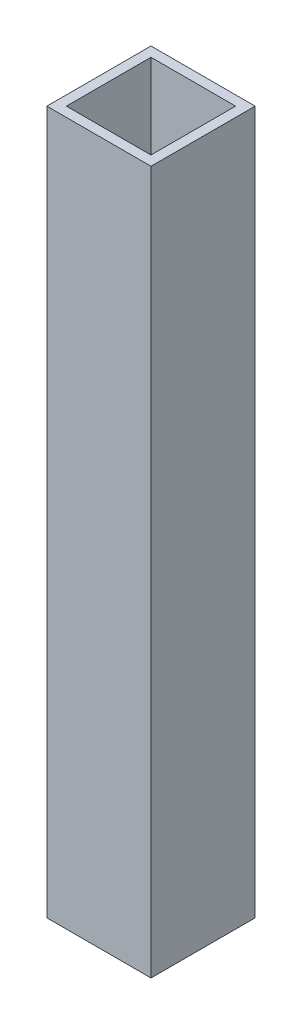
ISO-10303-21;
HEADER;
FILE_DESCRIPTION(('STEP AP214'),'2;1');
FILE_NAME('part.step','',(''),(''),'','','');
FILE_SCHEMA(('AUTOMOTIVE_DESIGN { 1 0 10303 214 1 1 1 1 }'));
ENDSEC;
DATA;
#1=APPLICATION_CONTEXT('core data for automotive mechanical design processes');
#2=APPLICATION_PROTOCOL_DEFINITION('international standard','automotive_design',2000,#1);
#3=PRODUCT_CONTEXT('',#1,'mechanical');
#4=PRODUCT('Part','Part','',(#3));
#5=PRODUCT_RELATED_PRODUCT_CATEGORY('part','',(#4));
#6=PRODUCT_DEFINITION_FORMATION('','',#4);
#7=PRODUCT_DEFINITION_CONTEXT('part definition',#1,'design');
#8=PRODUCT_DEFINITION('design','',#6,#7);
#9=PRODUCT_DEFINITION_SHAPE('','',#8);
#10=(LENGTH_UNIT() NAMED_UNIT(*) SI_UNIT(.MILLI.,.METRE.));
#11=(NAMED_UNIT(*) PLANE_ANGLE_UNIT() SI_UNIT($,.RADIAN.));
#12=(NAMED_UNIT(*) SI_UNIT($,.STERADIAN.) SOLID_ANGLE_UNIT());
#13=UNCERTAINTY_MEASURE_WITH_UNIT(LENGTH_MEASURE(1.E-05),#10,'distance_accuracy_value','');
#14=(GEOMETRIC_REPRESENTATION_CONTEXT(3) GLOBAL_UNCERTAINTY_ASSIGNED_CONTEXT((#13)) GLOBAL_UNIT_ASSIGNED_CONTEXT((#10,
#11,#12)) REPRESENTATION_CONTEXT('',''));
#15=CARTESIAN_POINT('',(0.,0.,0.));
#16=DIRECTION('',(0.,0.,1.));
#17=DIRECTION('',(1.,0.,0.));
#18=AXIS2_PLACEMENT_3D('',#15,#16,#17);
#19=CARTESIAN_POINT('',(25.4,171.45,50.8));
#20=DIRECTION('',(-1.,0.,0.));
#21=DIRECTION('',(0.,-1.,0.));
#22=AXIS2_PLACEMENT_3D('',#19,#20,#21);
#23=PLANE('',#22);
#24=DIRECTION('',(0.,1.,0.));
#25=VECTOR('',#24,1.);
#26=CARTESIAN_POINT('',(25.4,171.45,0.));
#27=LINE('',#26,#25);
#28=CARTESIAN_POINT('',(25.4,-171.45,0.));
#29=VERTEX_POINT('',#28);
#30=CARTESIAN_POINT('',(25.4,171.45,0.));
#31=VERTEX_POINT('',#30);
#32=EDGE_CURVE('E111',#29,#31,#27,.T.);
#33=ORIENTED_EDGE('',*,*,#32,.T.);
#34=DIRECTION('',(0.,0.,-1.));
#35=VECTOR('',#34,1.);
#36=CARTESIAN_POINT('',(25.4,171.45,50.8));
#37=LINE('',#36,#35);
#38=CARTESIAN_POINT('',(25.4,171.45,50.8));
#39=VERTEX_POINT('',#38);
#40=EDGE_CURVE('E11',#39,#31,#37,.T.);
#41=ORIENTED_EDGE('',*,*,#40,.F.);
#42=DIRECTION('',(0.,1.,0.));
#43=VECTOR('',#42,1.);
#44=CARTESIAN_POINT('',(25.4,171.45,50.8));
#45=LINE('',#44,#43);
#46=CARTESIAN_POINT('',(25.4,-171.45,50.8));
#47=VERTEX_POINT('',#46);
#48=EDGE_CURVE('E134',#47,#39,#45,.T.);
#49=ORIENTED_EDGE('',*,*,#48,.F.);
#50=DIRECTION('',(0.,0.,-1.));
#51=VECTOR('',#50,1.);
#52=CARTESIAN_POINT('',(25.4,-171.45,50.8));
#53=LINE('',#52,#51);
#54=EDGE_CURVE('E144',#47,#29,#53,.T.);
#55=ORIENTED_EDGE('',*,*,#54,.T.);
#56=EDGE_LOOP('',(#33,#41,#49,#55));
#57=FACE_BOUND('',#56,.T.);
#58=ADVANCED_FACE('F33',(#57),#23,.F.);
#59=CARTESIAN_POINT('',(-25.4,171.45,50.8));
#60=DIRECTION('',(0.,-1.,0.));
#61=DIRECTION('',(0.,0.,-1.));
#62=AXIS2_PLACEMENT_3D('',#59,#60,#61);
#63=PLANE('',#62);
#64=DIRECTION('',(0.,0.,-1.));
#65=VECTOR('',#64,1.);
#66=CARTESIAN_POINT('',(20.6375,171.45,46.0375));
#67=LINE('',#66,#65);
#68=CARTESIAN_POINT('',(20.6375,171.45,46.0375));
#69=VERTEX_POINT('',#68);
#70=CARTESIAN_POINT('',(20.6375,171.45,4.7625));
#71=VERTEX_POINT('',#70);
#72=EDGE_CURVE('E119',#69,#71,#67,.T.);
#73=ORIENTED_EDGE('',*,*,#72,.F.);
#74=DIRECTION('',(1.,0.,0.));
#75=VECTOR('',#74,1.);
#76=CARTESIAN_POINT('',(-20.6375,171.45,46.0375));
#77=LINE('',#76,#75);
#78=CARTESIAN_POINT('',(-20.6375,171.45,46.0375));
#79=VERTEX_POINT('',#78);
#80=EDGE_CURVE('E47',#79,#69,#77,.T.);
#81=ORIENTED_EDGE('',*,*,#80,.F.);
#82=DIRECTION('',(0.,0.,1.));
#83=VECTOR('',#82,1.);
#84=CARTESIAN_POINT('',(-20.6375,171.45,4.7625));
#85=LINE('',#84,#83);
#86=CARTESIAN_POINT('',(-20.6375,171.45,4.7625));
#87=VERTEX_POINT('',#86);
#88=EDGE_CURVE('E105',#87,#79,#85,.T.);
#89=ORIENTED_EDGE('',*,*,#88,.F.);
#90=DIRECTION('',(-1.,0.,0.));
#91=VECTOR('',#90,1.);
#92=CARTESIAN_POINT('',(20.6375,171.45,4.7625));
#93=LINE('',#92,#91);
#94=EDGE_CURVE('E125',#71,#87,#93,.T.);
#95=ORIENTED_EDGE('',*,*,#94,.F.);
#96=EDGE_LOOP('',(#73,#81,#89,#95));
#97=FACE_BOUND('',#96,.T.);
#98=DIRECTION('',(-1.,0.,0.));
#99=VECTOR('',#98,1.);
#100=CARTESIAN_POINT('',(-25.4,171.45,0.));
#101=LINE('',#100,#99);
#102=CARTESIAN_POINT('',(-25.4,171.45,0.));
#103=VERTEX_POINT('',#102);
#104=EDGE_CURVE('E147',#31,#103,#101,.T.);
#105=ORIENTED_EDGE('',*,*,#104,.T.);
#106=DIRECTION('',(0.,0.,-1.));
#107=VECTOR('',#106,1.);
#108=CARTESIAN_POINT('',(-25.4,171.45,50.8));
#109=LINE('',#108,#107);
#110=CARTESIAN_POINT('',(-25.4,171.45,50.8));
#111=VERTEX_POINT('',#110);
#112=EDGE_CURVE('E40',#111,#103,#109,.T.);
#113=ORIENTED_EDGE('',*,*,#112,.F.);
#114=DIRECTION('',(-1.,0.,0.));
#115=VECTOR('',#114,1.);
#116=CARTESIAN_POINT('',(-25.4,171.45,50.8));
#117=LINE('',#116,#115);
#118=EDGE_CURVE('E137',#39,#111,#117,.T.);
#119=ORIENTED_EDGE('',*,*,#118,.F.);
#120=ORIENTED_EDGE('',*,*,#40,.T.);
#121=EDGE_LOOP('',(#105,#113,#119,#120));
#122=FACE_BOUND('',#121,.T.);
#123=ADVANCED_FACE('F175',(#97,#122),#63,.F.);
#124=CARTESIAN_POINT('',(-25.4,171.45,50.8));
#125=DIRECTION('',(1.,0.,0.));
#126=DIRECTION('',(0.,1.,0.));
#127=AXIS2_PLACEMENT_3D('',#124,#125,#126);
#128=PLANE('',#127);
#129=DIRECTION('',(0.,-1.,0.));
#130=VECTOR('',#129,1.);
#131=CARTESIAN_POINT('',(-25.4,171.45,0.));
#132=LINE('',#131,#130);
#133=CARTESIAN_POINT('',(-25.4,-171.45,0.));
#134=VERTEX_POINT('',#133);
#135=EDGE_CURVE('E149',#103,#134,#132,.T.);
#136=ORIENTED_EDGE('',*,*,#135,.T.);
#137=DIRECTION('',(0.,0.,-1.));
#138=VECTOR('',#137,1.);
#139=CARTESIAN_POINT('',(-25.4,-171.45,50.8));
#140=LINE('',#139,#138);
#141=CARTESIAN_POINT('',(-25.4,-171.45,50.8));
#142=VERTEX_POINT('',#141);
#143=EDGE_CURVE('E154',#142,#134,#140,.T.);
#144=ORIENTED_EDGE('',*,*,#143,.F.);
#145=DIRECTION('',(0.,-1.,0.));
#146=VECTOR('',#145,1.);
#147=CARTESIAN_POINT('',(-25.4,171.45,50.8));
#148=LINE('',#147,#146);
#149=EDGE_CURVE('E140',#111,#142,#148,.T.);
#150=ORIENTED_EDGE('',*,*,#149,.F.);
#151=ORIENTED_EDGE('',*,*,#112,.T.);
#152=EDGE_LOOP('',(#136,#144,#150,#151));
#153=FACE_BOUND('',#152,.T.);
#154=ADVANCED_FACE('F161',(#153),#128,.F.);
#155=CARTESIAN_POINT('',(-25.4,-171.45,50.8));
#156=DIRECTION('',(0.,1.,0.));
#157=DIRECTION('',(0.,0.,1.));
#158=AXIS2_PLACEMENT_3D('',#155,#156,#157);
#159=PLANE('',#158);
#160=DIRECTION('',(0.,0.,-1.));
#161=VECTOR('',#160,1.);
#162=CARTESIAN_POINT('',(-20.6375,-171.45,4.7625));
#163=LINE('',#162,#161);
#164=CARTESIAN_POINT('',(-20.6375,-171.45,46.0375));
#165=VERTEX_POINT('',#164);
#166=CARTESIAN_POINT('',(-20.6375,-171.45,4.7625));
#167=VERTEX_POINT('',#166);
#168=EDGE_CURVE('E117',#165,#167,#163,.T.);
#169=ORIENTED_EDGE('',*,*,#168,.F.);
#170=DIRECTION('',(-1.,0.,0.));
#171=VECTOR('',#170,1.);
#172=CARTESIAN_POINT('',(-20.6375,-171.45,46.0375));
#173=LINE('',#172,#171);
#174=CARTESIAN_POINT('',(20.6375,-171.45,46.0375));
#175=VERTEX_POINT('',#174);
#176=EDGE_CURVE('E99',#175,#165,#173,.T.);
#177=ORIENTED_EDGE('',*,*,#176,.F.);
#178=DIRECTION('',(0.,0.,1.));
#179=VECTOR('',#178,1.);
#180=CARTESIAN_POINT('',(20.6375,-171.45,46.0375));
#181=LINE('',#180,#179);
#182=CARTESIAN_POINT('',(20.6375,-171.45,4.7625));
#183=VERTEX_POINT('',#182);
#184=EDGE_CURVE('E108',#183,#175,#181,.T.);
#185=ORIENTED_EDGE('',*,*,#184,.F.);
#186=DIRECTION('',(1.,0.,0.));
#187=VECTOR('',#186,1.);
#188=CARTESIAN_POINT('',(20.6375,-171.45,4.7625));
#189=LINE('',#188,#187);
#190=EDGE_CURVE('E55',#167,#183,#189,.T.);
#191=ORIENTED_EDGE('',*,*,#190,.F.);
#192=EDGE_LOOP('',(#169,#177,#185,#191));
#193=FACE_BOUND('',#192,.T.);
#194=DIRECTION('',(1.,0.,0.));
#195=VECTOR('',#194,1.);
#196=CARTESIAN_POINT('',(-25.4,-171.45,0.));
#197=LINE('',#196,#195);
#198=EDGE_CURVE('E138',#134,#29,#197,.T.);
#199=ORIENTED_EDGE('',*,*,#198,.T.);
#200=ORIENTED_EDGE('',*,*,#54,.F.);
#201=DIRECTION('',(1.,0.,0.));
#202=VECTOR('',#201,1.);
#203=CARTESIAN_POINT('',(-25.4,-171.45,50.8));
#204=LINE('',#203,#202);
#205=EDGE_CURVE('E142',#142,#47,#204,.T.);
#206=ORIENTED_EDGE('',*,*,#205,.F.);
#207=ORIENTED_EDGE('',*,*,#143,.T.);
#208=EDGE_LOOP('',(#199,#200,#206,#207));
#209=FACE_BOUND('',#208,.T.);
#210=ADVANCED_FACE('F114',(#193,#209),#159,.F.);
#211=CARTESIAN_POINT('',(25.4,-171.45,50.8));
#212=DIRECTION('',(0.,0.,1.));
#213=DIRECTION('',(1.,0.,0.));
#214=AXIS2_PLACEMENT_3D('',#211,#212,#213);
#215=PLANE('',#214);
#216=ORIENTED_EDGE('',*,*,#48,.T.);
#217=ORIENTED_EDGE('',*,*,#118,.T.);
#218=ORIENTED_EDGE('',*,*,#149,.T.);
#219=ORIENTED_EDGE('',*,*,#205,.T.);
#220=EDGE_LOOP('',(#216,#217,#218,#219));
#221=FACE_BOUND('',#220,.T.);
#222=ADVANCED_FACE('F174',(#221),#215,.T.);
#223=CARTESIAN_POINT('',(25.4,-171.45,0.));
#224=DIRECTION('',(0.,0.,1.));
#225=DIRECTION('',(1.,0.,0.));
#226=AXIS2_PLACEMENT_3D('',#223,#224,#225);
#227=PLANE('',#226);
#228=ORIENTED_EDGE('',*,*,#32,.F.);
#229=ORIENTED_EDGE('',*,*,#198,.F.);
#230=ORIENTED_EDGE('',*,*,#135,.F.);
#231=ORIENTED_EDGE('',*,*,#104,.F.);
#232=EDGE_LOOP('',(#228,#229,#230,#231));
#233=FACE_BOUND('',#232,.T.);
#234=ADVANCED_FACE('F167',(#233),#227,.F.);
#235=CARTESIAN_POINT('',(-20.6375,-171.451,46.0375));
#236=DIRECTION('',(0.,0.,1.));
#237=DIRECTION('',(1.,0.,0.));
#238=AXIS2_PLACEMENT_3D('',#235,#236,#237);
#239=PLANE('',#238);
#240=ORIENTED_EDGE('',*,*,#176,.T.);
#241=DIRECTION('',(0.,1.,0.));
#242=VECTOR('',#241,1.);
#243=CARTESIAN_POINT('',(-20.6375,-171.451,46.0375));
#244=LINE('',#243,#242);
#245=EDGE_CURVE('E112',#165,#79,#244,.T.);
#246=ORIENTED_EDGE('',*,*,#245,.T.);
#247=ORIENTED_EDGE('',*,*,#80,.T.);
#248=DIRECTION('',(0.,1.,0.));
#249=VECTOR('',#248,1.);
#250=CARTESIAN_POINT('',(20.6375,-171.451,46.0375));
#251=LINE('',#250,#249);
#252=EDGE_CURVE('E95',#175,#69,#251,.T.);
#253=ORIENTED_EDGE('',*,*,#252,.F.);
#254=EDGE_LOOP('',(#240,#246,#247,#253));
#255=FACE_BOUND('',#254,.T.);
#256=ADVANCED_FACE('F97',(#255),#239,.F.);
#257=CARTESIAN_POINT('',(-20.6375,-171.451,4.7625));
#258=DIRECTION('',(-1.,0.,0.));
#259=DIRECTION('',(0.,0.,1.));
#260=AXIS2_PLACEMENT_3D('',#257,#258,#259);
#261=PLANE('',#260);
#262=ORIENTED_EDGE('',*,*,#168,.T.);
#263=DIRECTION('',(0.,1.,0.));
#264=VECTOR('',#263,1.);
#265=CARTESIAN_POINT('',(-20.6375,-171.451,4.7625));
#266=LINE('',#265,#264);
#267=EDGE_CURVE('E131',#167,#87,#266,.T.);
#268=ORIENTED_EDGE('',*,*,#267,.T.);
#269=ORIENTED_EDGE('',*,*,#88,.T.);
#270=ORIENTED_EDGE('',*,*,#245,.F.);
#271=EDGE_LOOP('',(#262,#268,#269,#270));
#272=FACE_BOUND('',#271,.T.);
#273=ADVANCED_FACE('F192',(#272),#261,.F.);
#274=CARTESIAN_POINT('',(20.6375,-171.451,4.7625));
#275=DIRECTION('',(0.,0.,-1.));
#276=DIRECTION('',(-1.,0.,0.));
#277=AXIS2_PLACEMENT_3D('',#274,#275,#276);
#278=PLANE('',#277);
#279=ORIENTED_EDGE('',*,*,#190,.T.);
#280=DIRECTION('',(0.,1.,0.));
#281=VECTOR('',#280,1.);
#282=CARTESIAN_POINT('',(20.6375,-171.451,4.7625));
#283=LINE('',#282,#281);
#284=EDGE_CURVE('E104',#183,#71,#283,.T.);
#285=ORIENTED_EDGE('',*,*,#284,.T.);
#286=ORIENTED_EDGE('',*,*,#94,.T.);
#287=ORIENTED_EDGE('',*,*,#267,.F.);
#288=EDGE_LOOP('',(#279,#285,#286,#287));
#289=FACE_BOUND('',#288,.T.);
#290=ADVANCED_FACE('F195',(#289),#278,.F.);
#291=CARTESIAN_POINT('',(20.6375,-171.451,46.0375));
#292=DIRECTION('',(1.,0.,0.));
#293=DIRECTION('',(0.,0.,-1.));
#294=AXIS2_PLACEMENT_3D('',#291,#292,#293);
#295=PLANE('',#294);
#296=ORIENTED_EDGE('',*,*,#184,.T.);
#297=ORIENTED_EDGE('',*,*,#252,.T.);
#298=ORIENTED_EDGE('',*,*,#72,.T.);
#299=ORIENTED_EDGE('',*,*,#284,.F.);
#300=EDGE_LOOP('',(#296,#297,#298,#299));
#301=FACE_BOUND('',#300,.T.);
#302=ADVANCED_FACE('F109',(#301),#295,.F.);
#303=CLOSED_SHELL('',(#58,#123,#154,#210,#222,#234,#256,#273,#290,#302));
#304=MANIFOLD_SOLID_BREP('B2',#303);
#305=ADVANCED_BREP_SHAPE_REPRESENTATION('',(#18,#304),#14);
#306=SHAPE_DEFINITION_REPRESENTATION(#9,#305);
ENDSEC;
END-ISO-10303-21;
